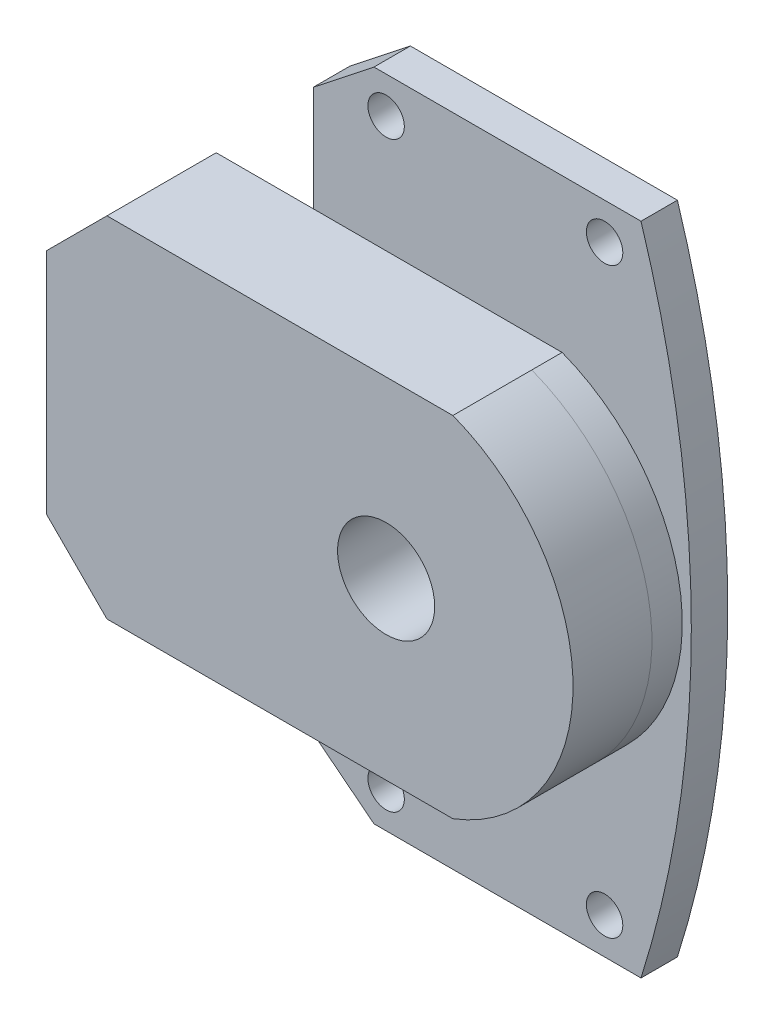
ISO-10303-21;
HEADER;
FILE_DESCRIPTION(('STEP AP214'),'2;1');
FILE_NAME('part.step','',(''),(''),'','','');
FILE_SCHEMA(('AUTOMOTIVE_DESIGN { 1 0 10303 214 1 1 1 1 }'));
ENDSEC;
DATA;
#1=APPLICATION_CONTEXT('core data for automotive mechanical design processes');
#2=APPLICATION_PROTOCOL_DEFINITION('international standard','automotive_design',2000,#1);
#3=PRODUCT_CONTEXT('',#1,'mechanical');
#4=PRODUCT('Part','Part','',(#3));
#5=PRODUCT_RELATED_PRODUCT_CATEGORY('part','',(#4));
#6=PRODUCT_DEFINITION_FORMATION('','',#4);
#7=PRODUCT_DEFINITION_CONTEXT('part definition',#1,'design');
#8=PRODUCT_DEFINITION('design','',#6,#7);
#9=PRODUCT_DEFINITION_SHAPE('','',#8);
#10=(LENGTH_UNIT() NAMED_UNIT(*) SI_UNIT(.MILLI.,.METRE.));
#11=(NAMED_UNIT(*) PLANE_ANGLE_UNIT() SI_UNIT($,.RADIAN.));
#12=(NAMED_UNIT(*) SI_UNIT($,.STERADIAN.) SOLID_ANGLE_UNIT());
#13=UNCERTAINTY_MEASURE_WITH_UNIT(LENGTH_MEASURE(1.E-05),#10,'distance_accuracy_value','');
#14=(GEOMETRIC_REPRESENTATION_CONTEXT(3) GLOBAL_UNCERTAINTY_ASSIGNED_CONTEXT((#13)) GLOBAL_UNIT_ASSIGNED_CONTEXT((#10,
#11,#12)) REPRESENTATION_CONTEXT('',''));
#15=CARTESIAN_POINT('',(0.,0.,0.));
#16=DIRECTION('',(0.,0.,1.));
#17=DIRECTION('',(1.,0.,0.));
#18=AXIS2_PLACEMENT_3D('',#15,#16,#17);
#19=CARTESIAN_POINT('',(-87.5169435511757,-10.5980462863294,-3.));
#20=DIRECTION('',(0.,0.,-1.));
#21=DIRECTION('',(-1.,0.,0.));
#22=AXIS2_PLACEMENT_3D('',#19,#20,#21);
#23=PLANE('',#22);
#24=CARTESIAN_POINT('',(-4.66241542365062,-34.5980462863294,-3.));
#25=DIRECTION('',(0.,0.,-1.));
#26=DIRECTION('',(1.,0.,0.));
#27=AXIS2_PLACEMENT_3D('',#24,#25,#26);
#28=CIRCLE('',#27,1.5);
#29=CARTESIAN_POINT('',(-3.16241542365062,-34.5980462863294,-3.));
#30=VERTEX_POINT('',#29);
#31=EDGE_CURVE('E207',#30,#30,#28,.T.);
#32=ORIENTED_EDGE('',*,*,#31,.F.);
#33=EDGE_LOOP('',(#32));
#34=FACE_BOUND('',#33,.T.);
#35=CARTESIAN_POINT('',(-4.66241542365062,13.4019537136706,-3.));
#36=DIRECTION('',(0.,0.,-1.));
#37=DIRECTION('',(-1.,0.,0.));
#38=AXIS2_PLACEMENT_3D('',#35,#36,#37);
#39=CIRCLE('',#38,1.5);
#40=CARTESIAN_POINT('',(-6.16241542365062,13.4019537136706,-3.));
#41=VERTEX_POINT('',#40);
#42=EDGE_CURVE('E219',#41,#41,#39,.T.);
#43=ORIENTED_EDGE('',*,*,#42,.F.);
#44=EDGE_LOOP('',(#43));
#45=FACE_BOUND('',#44,.T.);
#46=DIRECTION('',(-0.785278343538107,0.619142893983325,0.));
#47=VECTOR('',#46,1.);
#48=CARTESIAN_POINT('',(-28.6624154236506,-33.6558587863294,-3.));
#49=LINE('',#48,#47);
#50=CARTESIAN_POINT('',(-23.6624154236506,-37.5980462863294,-3.));
#51=VERTEX_POINT('',#50);
#52=CARTESIAN_POINT('',(-28.6624154236506,-33.6558587863294,-3.));
#53=VERTEX_POINT('',#52);
#54=EDGE_CURVE('E143',#51,#53,#49,.T.);
#55=ORIENTED_EDGE('',*,*,#54,.T.);
#56=DIRECTION('',(0.,1.,0.));
#57=VECTOR('',#56,1.);
#58=CARTESIAN_POINT('',(-28.6624154236506,12.4597662136706,-3.));
#59=LINE('',#58,#57);
#60=CARTESIAN_POINT('',(-28.6624154236506,12.4597662136706,-3.));
#61=VERTEX_POINT('',#60);
#62=EDGE_CURVE('E101',#53,#61,#59,.T.);
#63=ORIENTED_EDGE('',*,*,#62,.T.);
#64=DIRECTION('',(0.785278343538107,0.619142893983325,0.));
#65=VECTOR('',#64,1.);
#66=CARTESIAN_POINT('',(-23.6624154236506,16.4019537136706,-3.));
#67=LINE('',#66,#65);
#68=CARTESIAN_POINT('',(-23.6624154236506,16.4019537136706,-3.));
#69=VERTEX_POINT('',#68);
#70=EDGE_CURVE('E114',#61,#69,#67,.T.);
#71=ORIENTED_EDGE('',*,*,#70,.T.);
#72=DIRECTION('',(1.,0.,0.));
#73=VECTOR('',#72,1.);
#74=CARTESIAN_POINT('',(-23.6624154236506,16.4019537136706,-3.));
#75=LINE('',#74,#73);
#76=CARTESIAN_POINT('',(-1.66241542365062,16.4019537136706,-3.));
#77=VERTEX_POINT('',#76);
#78=EDGE_CURVE('E108',#69,#77,#75,.T.);
#79=ORIENTED_EDGE('',*,*,#78,.T.);
#80=CARTESIAN_POINT('',(-87.5169435511757,-10.5980462863294,-3.));
#81=DIRECTION('',(0.,0.,-1.));
#82=DIRECTION('',(-1.,0.,0.));
#83=AXIS2_PLACEMENT_3D('',#80,#81,#82);
#84=CIRCLE('',#83,90.);
#85=CARTESIAN_POINT('',(-1.66241542365062,-37.5980462863294,-3.));
#86=VERTEX_POINT('',#85);
#87=EDGE_CURVE('E112',#77,#86,#84,.T.);
#88=ORIENTED_EDGE('',*,*,#87,.T.);
#89=DIRECTION('',(-1.,0.,0.));
#90=VECTOR('',#89,1.);
#91=CARTESIAN_POINT('',(-23.6624154236506,-37.5980462863294,-3.));
#92=LINE('',#91,#90);
#93=EDGE_CURVE('E64',#86,#51,#92,.T.);
#94=ORIENTED_EDGE('',*,*,#93,.T.);
#95=EDGE_LOOP('',(#55,#63,#71,#79,#88,#94));
#96=FACE_BOUND('',#95,.T.);
#97=CARTESIAN_POINT('',(-13.6624154236506,-10.5980462863294,-3.));
#98=DIRECTION('',(0.,0.,-1.));
#99=DIRECTION('',(-1.,0.,0.));
#100=AXIS2_PLACEMENT_3D('',#97,#98,#99);
#101=CIRCLE('',#100,10.);
#102=CARTESIAN_POINT('',(-23.6624154236506,-10.5980462863294,-3.));
#103=VERTEX_POINT('',#102);
#104=EDGE_CURVE('E136',#103,#103,#101,.T.);
#105=ORIENTED_EDGE('',*,*,#104,.F.);
#106=EDGE_LOOP('',(#105));
#107=FACE_BOUND('',#106,.T.);
#108=CARTESIAN_POINT('',(-22.6624154236506,13.4019537136706,-3.));
#109=DIRECTION('',(0.,0.,-1.));
#110=DIRECTION('',(1.,0.,0.));
#111=AXIS2_PLACEMENT_3D('',#108,#109,#110);
#112=CIRCLE('',#111,1.5);
#113=CARTESIAN_POINT('',(-21.1624154236506,13.4019537136706,-3.));
#114=VERTEX_POINT('',#113);
#115=EDGE_CURVE('E213',#114,#114,#112,.T.);
#116=ORIENTED_EDGE('',*,*,#115,.F.);
#117=EDGE_LOOP('',(#116));
#118=FACE_BOUND('',#117,.T.);
#119=CARTESIAN_POINT('',(-22.6624154236506,-34.5980462863294,-3.));
#120=DIRECTION('',(0.,0.,-1.));
#121=DIRECTION('',(-1.,0.,0.));
#122=AXIS2_PLACEMENT_3D('',#119,#120,#121);
#123=CIRCLE('',#122,1.5);
#124=CARTESIAN_POINT('',(-24.1624154236506,-34.5980462863294,-3.));
#125=VERTEX_POINT('',#124);
#126=EDGE_CURVE('E198',#125,#125,#123,.T.);
#127=ORIENTED_EDGE('',*,*,#126,.F.);
#128=EDGE_LOOP('',(#127));
#129=FACE_BOUND('',#128,.T.);
#130=ADVANCED_FACE('F47',(#34,#45,#96,#107,#118,#129),#23,.T.);
#131=CARTESIAN_POINT('',(-87.5169435511757,-10.5980462863294,0.));
#132=DIRECTION('',(0.,0.,-1.));
#133=DIRECTION('',(-1.,0.,0.));
#134=AXIS2_PLACEMENT_3D('',#131,#132,#133);
#135=PLANE('',#134);
#136=DIRECTION('',(-0.785278343538107,0.619142893983325,0.));
#137=VECTOR('',#136,1.);
#138=CARTESIAN_POINT('',(-28.6624154236506,-33.6558587863294,0.));
#139=LINE('',#138,#137);
#140=CARTESIAN_POINT('',(-23.6624154236506,-37.5980462863294,0.));
#141=VERTEX_POINT('',#140);
#142=CARTESIAN_POINT('',(-28.6624154236506,-33.6558587863294,0.));
#143=VERTEX_POINT('',#142);
#144=EDGE_CURVE('E132',#141,#143,#139,.T.);
#145=ORIENTED_EDGE('',*,*,#144,.F.);
#146=DIRECTION('',(-1.,0.,0.));
#147=VECTOR('',#146,1.);
#148=CARTESIAN_POINT('',(-23.6624154236506,-37.5980462863294,0.));
#149=LINE('',#148,#147);
#150=CARTESIAN_POINT('',(-1.66241542365062,-37.5980462863294,0.));
#151=VERTEX_POINT('',#150);
#152=EDGE_CURVE('E93',#151,#141,#149,.T.);
#153=ORIENTED_EDGE('',*,*,#152,.F.);
#154=CARTESIAN_POINT('',(-87.5169435511757,-10.5980462863294,0.));
#155=DIRECTION('',(0.,0.,-1.));
#156=DIRECTION('',(-1.,0.,0.));
#157=AXIS2_PLACEMENT_3D('',#154,#155,#156);
#158=CIRCLE('',#157,90.);
#159=CARTESIAN_POINT('',(-1.66241542365062,16.4019537136706,0.));
#160=VERTEX_POINT('',#159);
#161=EDGE_CURVE('E87',#160,#151,#158,.T.);
#162=ORIENTED_EDGE('',*,*,#161,.F.);
#163=DIRECTION('',(1.,0.,0.));
#164=VECTOR('',#163,1.);
#165=CARTESIAN_POINT('',(-23.6624154236506,16.4019537136706,0.));
#166=LINE('',#165,#164);
#167=CARTESIAN_POINT('',(-23.6624154236506,16.4019537136706,0.));
#168=VERTEX_POINT('',#167);
#169=EDGE_CURVE('E122',#168,#160,#166,.T.);
#170=ORIENTED_EDGE('',*,*,#169,.F.);
#171=DIRECTION('',(0.785278343538107,0.619142893983325,0.));
#172=VECTOR('',#171,1.);
#173=CARTESIAN_POINT('',(-23.6624154236506,16.4019537136706,0.));
#174=LINE('',#173,#172);
#175=CARTESIAN_POINT('',(-28.6624154236506,12.4597662136706,0.));
#176=VERTEX_POINT('',#175);
#177=EDGE_CURVE('E138',#176,#168,#174,.T.);
#178=ORIENTED_EDGE('',*,*,#177,.F.);
#179=DIRECTION('',(0.,1.,0.));
#180=VECTOR('',#179,1.);
#181=CARTESIAN_POINT('',(-28.6624154236506,12.4597662136706,0.));
#182=LINE('',#181,#180);
#183=EDGE_CURVE('E135',#143,#176,#182,.T.);
#184=ORIENTED_EDGE('',*,*,#183,.F.);
#185=EDGE_LOOP('',(#145,#153,#162,#170,#178,#184));
#186=FACE_BOUND('',#185,.T.);
#187=CARTESIAN_POINT('',(-13.6624154236506,-10.5980462863294,0.));
#188=DIRECTION('',(0.,0.,-1.));
#189=DIRECTION('',(-1.,0.,0.));
#190=AXIS2_PLACEMENT_3D('',#187,#188,#189);
#191=CIRCLE('',#190,10.);
#192=CARTESIAN_POINT('',(-23.6624154236506,-10.5980462863294,0.));
#193=VERTEX_POINT('',#192);
#194=EDGE_CURVE('E222',#193,#193,#191,.T.);
#195=ORIENTED_EDGE('',*,*,#194,.T.);
#196=EDGE_LOOP('',(#195));
#197=FACE_BOUND('',#196,.T.);
#198=CARTESIAN_POINT('',(-4.66241542365062,13.4019537136706,0.));
#199=DIRECTION('',(0.,0.,-1.));
#200=DIRECTION('',(-1.,0.,0.));
#201=AXIS2_PLACEMENT_3D('',#198,#199,#200);
#202=CIRCLE('',#201,1.5);
#203=CARTESIAN_POINT('',(-6.16241542365062,13.4019537136706,0.));
#204=VERTEX_POINT('',#203);
#205=EDGE_CURVE('E216',#204,#204,#202,.T.);
#206=ORIENTED_EDGE('',*,*,#205,.T.);
#207=EDGE_LOOP('',(#206));
#208=FACE_BOUND('',#207,.T.);
#209=CARTESIAN_POINT('',(-22.6624154236506,13.4019537136706,0.));
#210=DIRECTION('',(0.,0.,-1.));
#211=DIRECTION('',(1.,0.,0.));
#212=AXIS2_PLACEMENT_3D('',#209,#210,#211);
#213=CIRCLE('',#212,1.5);
#214=CARTESIAN_POINT('',(-21.1624154236506,13.4019537136706,0.));
#215=VERTEX_POINT('',#214);
#216=EDGE_CURVE('E210',#215,#215,#213,.T.);
#217=ORIENTED_EDGE('',*,*,#216,.T.);
#218=EDGE_LOOP('',(#217));
#219=FACE_BOUND('',#218,.T.);
#220=CARTESIAN_POINT('',(-4.66241542365062,-34.5980462863294,0.));
#221=DIRECTION('',(0.,0.,-1.));
#222=DIRECTION('',(1.,0.,0.));
#223=AXIS2_PLACEMENT_3D('',#220,#221,#222);
#224=CIRCLE('',#223,1.5);
#225=CARTESIAN_POINT('',(-3.16241542365062,-34.5980462863294,0.));
#226=VERTEX_POINT('',#225);
#227=EDGE_CURVE('E204',#226,#226,#224,.T.);
#228=ORIENTED_EDGE('',*,*,#227,.T.);
#229=EDGE_LOOP('',(#228));
#230=FACE_BOUND('',#229,.T.);
#231=CARTESIAN_POINT('',(-22.6624154236506,-34.5980462863294,0.));
#232=DIRECTION('',(0.,0.,-1.));
#233=DIRECTION('',(-1.,0.,0.));
#234=AXIS2_PLACEMENT_3D('',#231,#232,#233);
#235=CIRCLE('',#234,1.5);
#236=CARTESIAN_POINT('',(-24.1624154236506,-34.5980462863294,0.));
#237=VERTEX_POINT('',#236);
#238=EDGE_CURVE('E201',#237,#237,#235,.T.);
#239=ORIENTED_EDGE('',*,*,#238,.T.);
#240=EDGE_LOOP('',(#239));
#241=FACE_BOUND('',#240,.T.);
#242=ADVANCED_FACE('F152',(#186,#197,#208,#219,#230,#241),#135,.F.);
#243=CARTESIAN_POINT('',(-28.6624154236506,-33.6558587863294,-3.));
#244=DIRECTION('',(0.619142893983325,0.785278343538107,0.));
#245=DIRECTION('',(-0.785278343538107,0.619142893983325,0.));
#246=AXIS2_PLACEMENT_3D('',#243,#244,#245);
#247=PLANE('',#246);
#248=ORIENTED_EDGE('',*,*,#144,.T.);
#249=DIRECTION('',(0.,0.,1.));
#250=VECTOR('',#249,1.);
#251=CARTESIAN_POINT('',(-28.6624154236506,-33.6558587863294,-3.));
#252=LINE('',#251,#250);
#253=EDGE_CURVE('E12',#53,#143,#252,.T.);
#254=ORIENTED_EDGE('',*,*,#253,.F.);
#255=ORIENTED_EDGE('',*,*,#54,.F.);
#256=DIRECTION('',(0.,0.,1.));
#257=VECTOR('',#256,1.);
#258=CARTESIAN_POINT('',(-23.6624154236506,-37.5980462863294,-3.));
#259=LINE('',#258,#257);
#260=EDGE_CURVE('E128',#51,#141,#259,.T.);
#261=ORIENTED_EDGE('',*,*,#260,.T.);
#262=EDGE_LOOP('',(#248,#254,#255,#261));
#263=FACE_BOUND('',#262,.T.);
#264=ADVANCED_FACE('F49',(#263),#247,.F.);
#265=CARTESIAN_POINT('',(-28.6624154236506,12.4597662136706,-3.));
#266=DIRECTION('',(1.,0.,0.));
#267=DIRECTION('',(0.,1.,0.));
#268=AXIS2_PLACEMENT_3D('',#265,#266,#267);
#269=PLANE('',#268);
#270=ORIENTED_EDGE('',*,*,#183,.T.);
#271=DIRECTION('',(0.,0.,1.));
#272=VECTOR('',#271,1.);
#273=CARTESIAN_POINT('',(-28.6624154236506,12.4597662136706,-3.));
#274=LINE('',#273,#272);
#275=EDGE_CURVE('E56',#61,#176,#274,.T.);
#276=ORIENTED_EDGE('',*,*,#275,.F.);
#277=ORIENTED_EDGE('',*,*,#62,.F.);
#278=ORIENTED_EDGE('',*,*,#253,.T.);
#279=EDGE_LOOP('',(#270,#276,#277,#278));
#280=FACE_BOUND('',#279,.T.);
#281=ADVANCED_FACE('F289',(#280),#269,.F.);
#282=CARTESIAN_POINT('',(-23.6624154236506,16.4019537136706,-3.));
#283=DIRECTION('',(0.619142893983325,-0.785278343538107,0.));
#284=DIRECTION('',(0.785278343538107,0.619142893983325,0.));
#285=AXIS2_PLACEMENT_3D('',#282,#283,#284);
#286=PLANE('',#285);
#287=ORIENTED_EDGE('',*,*,#177,.T.);
#288=DIRECTION('',(0.,0.,1.));
#289=VECTOR('',#288,1.);
#290=CARTESIAN_POINT('',(-23.6624154236506,16.4019537136706,-3.));
#291=LINE('',#290,#289);
#292=EDGE_CURVE('E123',#69,#168,#291,.T.);
#293=ORIENTED_EDGE('',*,*,#292,.F.);
#294=ORIENTED_EDGE('',*,*,#70,.F.);
#295=ORIENTED_EDGE('',*,*,#275,.T.);
#296=EDGE_LOOP('',(#287,#293,#294,#295));
#297=FACE_BOUND('',#296,.T.);
#298=ADVANCED_FACE('F149',(#297),#286,.F.);
#299=CARTESIAN_POINT('',(-23.6624154236506,16.4019537136706,-3.));
#300=DIRECTION('',(0.,-1.,0.));
#301=DIRECTION('',(1.,0.,0.));
#302=AXIS2_PLACEMENT_3D('',#299,#300,#301);
#303=PLANE('',#302);
#304=ORIENTED_EDGE('',*,*,#169,.T.);
#305=DIRECTION('',(0.,0.,1.));
#306=VECTOR('',#305,1.);
#307=CARTESIAN_POINT('',(-1.66241542365062,16.4019537136706,-3.));
#308=LINE('',#307,#306);
#309=EDGE_CURVE('E119',#77,#160,#308,.T.);
#310=ORIENTED_EDGE('',*,*,#309,.F.);
#311=ORIENTED_EDGE('',*,*,#78,.F.);
#312=ORIENTED_EDGE('',*,*,#292,.T.);
#313=EDGE_LOOP('',(#304,#310,#311,#312));
#314=FACE_BOUND('',#313,.T.);
#315=ADVANCED_FACE('F120',(#314),#303,.F.);
#316=CARTESIAN_POINT('',(-87.5169435511757,-10.5980462863294,-3.));
#317=DIRECTION('',(0.,0.,1.));
#318=DIRECTION('',(1.,0.,0.));
#319=AXIS2_PLACEMENT_3D('',#316,#317,#318);
#320=CYLINDRICAL_SURFACE('',#319,90.);
#321=ORIENTED_EDGE('',*,*,#161,.T.);
#322=DIRECTION('',(0.,0.,1.));
#323=VECTOR('',#322,1.);
#324=CARTESIAN_POINT('',(-1.66241542365062,-37.5980462863294,-3.));
#325=LINE('',#324,#323);
#326=EDGE_CURVE('E124',#86,#151,#325,.T.);
#327=ORIENTED_EDGE('',*,*,#326,.F.);
#328=ORIENTED_EDGE('',*,*,#87,.F.);
#329=ORIENTED_EDGE('',*,*,#309,.T.);
#330=EDGE_LOOP('',(#321,#327,#328,#329));
#331=FACE_BOUND('',#330,.T.);
#332=ADVANCED_FACE('F126',(#331),#320,.T.);
#333=CARTESIAN_POINT('',(-23.6624154236506,-37.5980462863294,-3.));
#334=DIRECTION('',(0.,1.,0.));
#335=DIRECTION('',(-1.,0.,0.));
#336=AXIS2_PLACEMENT_3D('',#333,#334,#335);
#337=PLANE('',#336);
#338=ORIENTED_EDGE('',*,*,#152,.T.);
#339=ORIENTED_EDGE('',*,*,#260,.F.);
#340=ORIENTED_EDGE('',*,*,#93,.F.);
#341=ORIENTED_EDGE('',*,*,#326,.T.);
#342=EDGE_LOOP('',(#338,#339,#340,#341));
#343=FACE_BOUND('',#342,.T.);
#344=ADVANCED_FACE('F157',(#343),#337,.F.);
#345=CARTESIAN_POINT('',(-13.6624154236506,-10.5980462863294,-3.));
#346=DIRECTION('',(0.,0.,1.));
#347=DIRECTION('',(1.,0.,0.));
#348=AXIS2_PLACEMENT_3D('',#345,#346,#347);
#349=CYLINDRICAL_SURFACE('',#348,10.);
#350=ORIENTED_EDGE('',*,*,#104,.T.);
#351=EDGE_LOOP('',(#350));
#352=FACE_BOUND('',#351,.T.);
#353=ORIENTED_EDGE('',*,*,#194,.F.);
#354=EDGE_LOOP('',(#353));
#355=FACE_BOUND('',#354,.T.);
#356=ADVANCED_FACE('F159',(#352,#355),#349,.F.);
#357=CARTESIAN_POINT('',(-4.66241542365062,13.4019537136706,-3.));
#358=DIRECTION('',(0.,0.,1.));
#359=DIRECTION('',(1.,0.,0.));
#360=AXIS2_PLACEMENT_3D('',#357,#358,#359);
#361=CYLINDRICAL_SURFACE('',#360,1.5);
#362=ORIENTED_EDGE('',*,*,#42,.T.);
#363=EDGE_LOOP('',(#362));
#364=FACE_BOUND('',#363,.T.);
#365=ORIENTED_EDGE('',*,*,#205,.F.);
#366=EDGE_LOOP('',(#365));
#367=FACE_BOUND('',#366,.T.);
#368=ADVANCED_FACE('F165',(#364,#367),#361,.F.);
#369=CARTESIAN_POINT('',(-22.6624154236506,13.4019537136706,-3.));
#370=DIRECTION('',(0.,0.,1.));
#371=DIRECTION('',(1.,0.,0.));
#372=AXIS2_PLACEMENT_3D('',#369,#370,#371);
#373=CYLINDRICAL_SURFACE('',#372,1.5);
#374=ORIENTED_EDGE('',*,*,#115,.T.);
#375=EDGE_LOOP('',(#374));
#376=FACE_BOUND('',#375,.T.);
#377=ORIENTED_EDGE('',*,*,#216,.F.);
#378=EDGE_LOOP('',(#377));
#379=FACE_BOUND('',#378,.T.);
#380=ADVANCED_FACE('F181',(#376,#379),#373,.F.);
#381=CARTESIAN_POINT('',(-4.66241542365062,-34.5980462863294,-3.));
#382=DIRECTION('',(0.,0.,1.));
#383=DIRECTION('',(1.,0.,0.));
#384=AXIS2_PLACEMENT_3D('',#381,#382,#383);
#385=CYLINDRICAL_SURFACE('',#384,1.5);
#386=ORIENTED_EDGE('',*,*,#31,.T.);
#387=EDGE_LOOP('',(#386));
#388=FACE_BOUND('',#387,.T.);
#389=ORIENTED_EDGE('',*,*,#227,.F.);
#390=EDGE_LOOP('',(#389));
#391=FACE_BOUND('',#390,.T.);
#392=ADVANCED_FACE('F185',(#388,#391),#385,.F.);
#393=CARTESIAN_POINT('',(-22.6624154236506,-34.5980462863294,-3.));
#394=DIRECTION('',(0.,0.,1.));
#395=DIRECTION('',(1.,0.,0.));
#396=AXIS2_PLACEMENT_3D('',#393,#394,#395);
#397=CYLINDRICAL_SURFACE('',#396,1.5);
#398=ORIENTED_EDGE('',*,*,#126,.T.);
#399=EDGE_LOOP('',(#398));
#400=FACE_BOUND('',#399,.T.);
#401=ORIENTED_EDGE('',*,*,#238,.F.);
#402=EDGE_LOOP('',(#401));
#403=FACE_BOUND('',#402,.T.);
#404=ADVANCED_FACE('F189',(#400,#403),#397,.F.);
#405=CLOSED_SHELL('',(#130,#242,#264,#281,#298,#315,#332,#344,#356,#368,#380,#392,#404));
#406=MANIFOLD_SOLID_BREP('B2',#405);
#407=CARTESIAN_POINT('',(-13.6624154236506,-10.5980462863294,1.74455679792347E-13));
#408=DIRECTION('',(0.,0.,1.));
#409=DIRECTION('',(1.,0.,0.));
#410=AXIS2_PLACEMENT_3D('',#407,#408,#409);
#411=PLANE('',#410);
#412=DIRECTION('',(-0.707106781186547,-0.707106781186548,0.));
#413=VECTOR('',#412,1.);
#414=CARTESIAN_POINT('',(-36.6624154236506,3.78695371367061,1.74455679792347E-13));
#415=LINE('',#414,#413);
#416=CARTESIAN_POINT('',(-36.6624154236506,3.78695371367061,1.74455679792347E-13));
#417=VERTEX_POINT('',#416);
#418=CARTESIAN_POINT('',(-41.6624154236506,-1.21304628632939,1.74455679792347E-13));
#419=VERTEX_POINT('',#418);
#420=EDGE_CURVE('E387',#417,#419,#415,.T.);
#421=ORIENTED_EDGE('',*,*,#420,.F.);
#422=DIRECTION('',(-1.,0.,0.));
#423=VECTOR('',#422,1.);
#424=CARTESIAN_POINT('',(-19.1624154236506,3.78695371367061,1.74455679792347E-13));
#425=LINE('',#424,#423);
#426=CARTESIAN_POINT('',(-8.16241542365062,3.78695371367061,1.74455679792347E-13));
#427=VERTEX_POINT('',#426);
#428=EDGE_CURVE('E371',#427,#417,#425,.T.);
#429=ORIENTED_EDGE('',*,*,#428,.F.);
#430=CARTESIAN_POINT('',(-13.6624154236506,-10.5980462863294,1.74455679792347E-13));
#431=DIRECTION('',(0.,0.,1.));
#432=DIRECTION('',(1.,0.,0.));
#433=AXIS2_PLACEMENT_3D('',#430,#431,#432);
#434=CIRCLE('',#433,15.4005917094117);
#435=CARTESIAN_POINT('',(-8.16241542365062,-24.9830462863294,1.74455679792347E-13));
#436=VERTEX_POINT('',#435);
#437=EDGE_CURVE('E381',#436,#427,#434,.T.);
#438=ORIENTED_EDGE('',*,*,#437,.F.);
#439=DIRECTION('',(1.,0.,0.));
#440=VECTOR('',#439,1.);
#441=CARTESIAN_POINT('',(-19.1624154236506,-24.9830462863294,1.74455679792347E-13));
#442=LINE('',#441,#440);
#443=CARTESIAN_POINT('',(-36.6624154236506,-24.9830462863294,1.74455679792347E-13));
#444=VERTEX_POINT('',#443);
#445=EDGE_CURVE('E405',#444,#436,#442,.T.);
#446=ORIENTED_EDGE('',*,*,#445,.F.);
#447=DIRECTION('',(0.707106781186548,-0.707106781186547,0.));
#448=VECTOR('',#447,1.);
#449=CARTESIAN_POINT('',(-41.6624154236506,-19.9830462863294,1.74455679792347E-13));
#450=LINE('',#449,#448);
#451=CARTESIAN_POINT('',(-41.6624154236506,-19.9830462863294,1.74455679792347E-13));
#452=VERTEX_POINT('',#451);
#453=EDGE_CURVE('E396',#452,#444,#450,.T.);
#454=ORIENTED_EDGE('',*,*,#453,.F.);
#455=DIRECTION('',(0.,-1.,0.));
#456=VECTOR('',#455,1.);
#457=CARTESIAN_POINT('',(-41.6624154236506,-1.21304628632939,1.74455679792347E-13));
#458=LINE('',#457,#456);
#459=EDGE_CURVE('E393',#419,#452,#458,.T.);
#460=ORIENTED_EDGE('',*,*,#459,.F.);
#461=EDGE_LOOP('',(#421,#429,#438,#446,#454,#460));
#462=FACE_BOUND('',#461,.T.);
#463=CARTESIAN_POINT('',(-29.4124154236506,-21.0780462863294,1.74455679792347E-13));
#464=DIRECTION('',(0.,0.,1.));
#465=DIRECTION('',(1.,0.,0.));
#466=AXIS2_PLACEMENT_3D('',#463,#464,#465);
#467=CIRCLE('',#466,1.98);
#468=CARTESIAN_POINT('',(-27.4324154236506,-21.0780462863294,1.74455679792347E-13));
#469=VERTEX_POINT('',#468);
#470=EDGE_CURVE('E394',#469,#469,#467,.T.);
#471=ORIENTED_EDGE('',*,*,#470,.T.);
#472=EDGE_LOOP('',(#471));
#473=FACE_BOUND('',#472,.T.);
#474=CARTESIAN_POINT('',(-29.4124154236506,-0.118046286329387,1.74455679792347E-13));
#475=DIRECTION('',(0.,0.,1.));
#476=DIRECTION('',(1.,0.,0.));
#477=AXIS2_PLACEMENT_3D('',#474,#475,#476);
#478=CIRCLE('',#477,1.98);
#479=CARTESIAN_POINT('',(-27.4324154236506,-0.118046286329387,1.74455679792347E-13));
#480=VERTEX_POINT('',#479);
#481=EDGE_CURVE('E399',#480,#480,#478,.T.);
#482=ORIENTED_EDGE('',*,*,#481,.T.);
#483=EDGE_LOOP('',(#482));
#484=FACE_BOUND('',#483,.T.);
#485=CARTESIAN_POINT('',(-13.6624154236506,-10.5980462863294,1.74455679792347E-13));
#486=DIRECTION('',(0.,0.,1.));
#487=DIRECTION('',(1.,0.,0.));
#488=AXIS2_PLACEMENT_3D('',#485,#486,#487);
#489=CIRCLE('',#488,6.3);
#490=CARTESIAN_POINT('',(-7.36241542365062,-10.5980462863294,1.74455679792347E-13));
#491=VERTEX_POINT('',#490);
#492=EDGE_CURVE('E580',#491,#491,#489,.T.);
#493=ORIENTED_EDGE('',*,*,#492,.T.);
#494=EDGE_LOOP('',(#493));
#495=FACE_BOUND('',#494,.T.);
#496=CARTESIAN_POINT('',(-13.6624154236506,-1.07304628632939,1.74455679792347E-13));
#497=DIRECTION('',(0.,0.,1.));
#498=DIRECTION('',(1.,0.,0.));
#499=AXIS2_PLACEMENT_3D('',#496,#497,#498);
#500=CIRCLE('',#499,1.475);
#501=CARTESIAN_POINT('',(-12.1874154236506,-1.07304628632939,1.74455679792347E-13));
#502=VERTEX_POINT('',#501);
#503=EDGE_CURVE('E577',#502,#502,#500,.T.);
#504=ORIENTED_EDGE('',*,*,#503,.T.);
#505=EDGE_LOOP('',(#504));
#506=FACE_BOUND('',#505,.T.);
#507=CARTESIAN_POINT('',(-13.6624154236506,-20.1230462863294,1.74455679792347E-13));
#508=DIRECTION('',(0.,0.,1.));
#509=DIRECTION('',(1.,0.,0.));
#510=AXIS2_PLACEMENT_3D('',#507,#508,#509);
#511=CIRCLE('',#510,1.475);
#512=CARTESIAN_POINT('',(-12.1874154236506,-20.1230462863294,1.74455679792347E-13));
#513=VERTEX_POINT('',#512);
#514=EDGE_CURVE('E574',#513,#513,#511,.T.);
#515=ORIENTED_EDGE('',*,*,#514,.T.);
#516=EDGE_LOOP('',(#515));
#517=FACE_BOUND('',#516,.T.);
#518=CARTESIAN_POINT('',(-4.6821593025815,-19.5783024073986,1.74455679792347E-13));
#519=DIRECTION('',(0.,0.,1.));
#520=DIRECTION('',(1.,0.,0.));
#521=AXIS2_PLACEMENT_3D('',#518,#519,#520);
#522=CIRCLE('',#521,1.05);
#523=CARTESIAN_POINT('',(-3.6321593025815,-19.5783024073986,1.74455679792347E-13));
#524=VERTEX_POINT('',#523);
#525=EDGE_CURVE('E571',#524,#524,#522,.T.);
#526=ORIENTED_EDGE('',*,*,#525,.T.);
#527=EDGE_LOOP('',(#526));
#528=FACE_BOUND('',#527,.T.);
#529=CARTESIAN_POINT('',(-4.6821593025815,-1.61779016526022,1.74455679792347E-13));
#530=DIRECTION('',(0.,0.,1.));
#531=DIRECTION('',(1.,0.,0.));
#532=AXIS2_PLACEMENT_3D('',#529,#530,#531);
#533=CIRCLE('',#532,1.05);
#534=CARTESIAN_POINT('',(-3.6321593025815,-1.61779016526022,1.74455679792347E-13));
#535=VERTEX_POINT('',#534);
#536=EDGE_CURVE('E568',#535,#535,#533,.T.);
#537=ORIENTED_EDGE('',*,*,#536,.T.);
#538=EDGE_LOOP('',(#537));
#539=FACE_BOUND('',#538,.T.);
#540=CARTESIAN_POINT('',(-22.6426715447198,-1.61779016526022,1.74455679792347E-13));
#541=DIRECTION('',(0.,0.,1.));
#542=DIRECTION('',(1.,0.,0.));
#543=AXIS2_PLACEMENT_3D('',#540,#541,#542);
#544=CIRCLE('',#543,1.05);
#545=CARTESIAN_POINT('',(-21.5926715447198,-1.61779016526022,1.74455679792347E-13));
#546=VERTEX_POINT('',#545);
#547=EDGE_CURVE('E565',#546,#546,#544,.T.);
#548=ORIENTED_EDGE('',*,*,#547,.T.);
#549=EDGE_LOOP('',(#548));
#550=FACE_BOUND('',#549,.T.);
#551=CARTESIAN_POINT('',(-22.6426715447198,-19.5783024073986,1.74455679792347E-13));
#552=DIRECTION('',(0.,0.,1.));
#553=DIRECTION('',(1.,0.,0.));
#554=AXIS2_PLACEMENT_3D('',#551,#552,#553);
#555=CIRCLE('',#554,1.05);
#556=CARTESIAN_POINT('',(-21.5926715447198,-19.5783024073986,1.74455679792347E-13));
#557=VERTEX_POINT('',#556);
#558=EDGE_CURVE('E562',#557,#557,#555,.T.);
#559=ORIENTED_EDGE('',*,*,#558,.T.);
#560=EDGE_LOOP('',(#559));
#561=FACE_BOUND('',#560,.T.);
#562=CARTESIAN_POINT('',(-17.6624154236506,-3.66984305605386,1.74455679792347E-13));
#563=DIRECTION('',(0.,0.,1.));
#564=DIRECTION('',(1.,0.,0.));
#565=AXIS2_PLACEMENT_3D('',#562,#563,#564);
#566=CIRCLE('',#565,0.85);
#567=CARTESIAN_POINT('',(-16.8124154236506,-3.66984305605386,1.74455679792347E-13));
#568=VERTEX_POINT('',#567);
#569=EDGE_CURVE('E559',#568,#568,#566,.T.);
#570=ORIENTED_EDGE('',*,*,#569,.T.);
#571=EDGE_LOOP('',(#570));
#572=FACE_BOUND('',#571,.T.);
#573=CARTESIAN_POINT('',(-9.66241542365067,-17.5262495166049,1.74455679792347E-13));
#574=DIRECTION('',(0.,0.,1.));
#575=DIRECTION('',(1.,0.,0.));
#576=AXIS2_PLACEMENT_3D('',#573,#574,#575);
#577=CIRCLE('',#576,0.85);
#578=CARTESIAN_POINT('',(-8.81241542365067,-17.5262495166049,1.74455679792347E-13));
#579=VERTEX_POINT('',#578);
#580=EDGE_CURVE('E556',#579,#579,#577,.T.);
#581=ORIENTED_EDGE('',*,*,#580,.T.);
#582=EDGE_LOOP('',(#581));
#583=FACE_BOUND('',#582,.T.);
#584=ADVANCED_FACE('F328',(#462,#473,#484,#495,#506,#517,#528,#539,#550,#561,#572,#583),#411,.F.);
#585=CARTESIAN_POINT('',(-36.6624154236506,3.78695371367061,2.50000000000017));
#586=DIRECTION('',(0.707106781186548,-0.707106781186547,0.));
#587=DIRECTION('',(0.707106781186547,0.707106781186548,0.));
#588=AXIS2_PLACEMENT_3D('',#585,#586,#587);
#589=PLANE('',#588);
#590=ORIENTED_EDGE('',*,*,#420,.T.);
#591=DIRECTION('',(0.,0.,-1.));
#592=VECTOR('',#591,1.);
#593=CARTESIAN_POINT('',(-41.6624154236506,-1.21304628632939,2.50000000000017));
#594=LINE('',#593,#592);
#595=CARTESIAN_POINT('',(-41.6624154236506,-1.21304628632939,9.00000000000017));
#596=VERTEX_POINT('',#595);
#597=EDGE_CURVE('E45',#596,#419,#594,.T.);
#598=ORIENTED_EDGE('',*,*,#597,.F.);
#599=DIRECTION('',(-0.707106781186547,-0.707106781186548,0.));
#600=VECTOR('',#599,1.);
#601=CARTESIAN_POINT('',(-36.6624154236506,3.78695371367061,9.00000000000017));
#602=LINE('',#601,#600);
#603=CARTESIAN_POINT('',(-36.6624154236506,3.78695371367061,9.00000000000017));
#604=VERTEX_POINT('',#603);
#605=EDGE_CURVE('E389',#604,#596,#602,.T.);
#606=ORIENTED_EDGE('',*,*,#605,.F.);
#607=DIRECTION('',(0.,0.,-1.));
#608=VECTOR('',#607,1.);
#609=CARTESIAN_POINT('',(-36.6624154236506,3.78695371367061,2.50000000000017));
#610=LINE('',#609,#608);
#611=EDGE_CURVE('E377',#604,#417,#610,.T.);
#612=ORIENTED_EDGE('',*,*,#611,.T.);
#613=EDGE_LOOP('',(#590,#598,#606,#612));
#614=FACE_BOUND('',#613,.T.);
#615=ADVANCED_FACE('F330',(#614),#589,.F.);
#616=CARTESIAN_POINT('',(-41.6624154236506,-1.21304628632939,2.50000000000017));
#617=DIRECTION('',(1.,0.,0.));
#618=DIRECTION('',(0.,1.,0.));
#619=AXIS2_PLACEMENT_3D('',#616,#617,#618);
#620=PLANE('',#619);
#621=ORIENTED_EDGE('',*,*,#459,.T.);
#622=DIRECTION('',(0.,0.,-1.));
#623=VECTOR('',#622,1.);
#624=CARTESIAN_POINT('',(-41.6624154236506,-19.9830462863294,2.50000000000017));
#625=LINE('',#624,#623);
#626=CARTESIAN_POINT('',(-41.6624154236506,-19.9830462863294,9.00000000000017));
#627=VERTEX_POINT('',#626);
#628=EDGE_CURVE('E338',#627,#452,#625,.T.);
#629=ORIENTED_EDGE('',*,*,#628,.F.);
#630=DIRECTION('',(0.,-1.,0.));
#631=VECTOR('',#630,1.);
#632=CARTESIAN_POINT('',(-41.6624154236506,-19.9830462863294,9.00000000000017));
#633=LINE('',#632,#631);
#634=EDGE_CURVE('E683',#596,#627,#633,.T.);
#635=ORIENTED_EDGE('',*,*,#634,.F.);
#636=ORIENTED_EDGE('',*,*,#597,.T.);
#637=EDGE_LOOP('',(#621,#629,#635,#636));
#638=FACE_BOUND('',#637,.T.);
#639=ADVANCED_FACE('F439',(#638),#620,.F.);
#640=CARTESIAN_POINT('',(-41.6624154236506,-19.9830462863294,2.50000000000017));
#641=DIRECTION('',(0.707106781186547,0.707106781186548,0.));
#642=DIRECTION('',(-0.707106781186548,0.707106781186547,0.));
#643=AXIS2_PLACEMENT_3D('',#640,#641,#642);
#644=PLANE('',#643);
#645=ORIENTED_EDGE('',*,*,#453,.T.);
#646=DIRECTION('',(0.,0.,-1.));
#647=VECTOR('',#646,1.);
#648=CARTESIAN_POINT('',(-36.6624154236506,-24.9830462863294,2.50000000000017));
#649=LINE('',#648,#647);
#650=CARTESIAN_POINT('',(-36.6624154236506,-24.9830462863294,9.00000000000017));
#651=VERTEX_POINT('',#650);
#652=EDGE_CURVE('E408',#651,#444,#649,.T.);
#653=ORIENTED_EDGE('',*,*,#652,.F.);
#654=DIRECTION('',(0.707106781186548,-0.707106781186547,0.));
#655=VECTOR('',#654,1.);
#656=CARTESIAN_POINT('',(-36.6624154236506,-24.9830462863294,9.00000000000017));
#657=LINE('',#656,#655);
#658=EDGE_CURVE('E690',#627,#651,#657,.T.);
#659=ORIENTED_EDGE('',*,*,#658,.F.);
#660=ORIENTED_EDGE('',*,*,#628,.T.);
#661=EDGE_LOOP('',(#645,#653,#659,#660));
#662=FACE_BOUND('',#661,.T.);
#663=ADVANCED_FACE('F436',(#662),#644,.F.);
#664=CARTESIAN_POINT('',(-19.1624154236506,-24.9830462863294,2.50000000000017));
#665=DIRECTION('',(0.,1.,0.));
#666=DIRECTION('',(0.,0.,1.));
#667=AXIS2_PLACEMENT_3D('',#664,#665,#666);
#668=PLANE('',#667);
#669=ORIENTED_EDGE('',*,*,#445,.T.);
#670=DIRECTION('',(0.,0.,-1.));
#671=VECTOR('',#670,1.);
#672=CARTESIAN_POINT('',(-8.16241542365062,-24.9830462863294,2.50000000000017));
#673=LINE('',#672,#671);
#674=CARTESIAN_POINT('',(-8.16241542365062,-24.9830462863294,2.50000000000017));
#675=VERTEX_POINT('',#674);
#676=EDGE_CURVE('E411',#675,#436,#673,.T.);
#677=ORIENTED_EDGE('',*,*,#676,.F.);
#678=DIRECTION('',(0.,0.,-1.));
#679=VECTOR('',#678,1.);
#680=CARTESIAN_POINT('',(-8.16241542365061,-24.9830462863294,9.00000000000017));
#681=LINE('',#680,#679);
#682=CARTESIAN_POINT('',(-8.16241542365061,-24.9830462863294,9.00000000000017));
#683=VERTEX_POINT('',#682);
#684=EDGE_CURVE('E509',#683,#675,#681,.T.);
#685=ORIENTED_EDGE('',*,*,#684,.F.);
#686=DIRECTION('',(1.,0.,0.));
#687=VECTOR('',#686,1.);
#688=CARTESIAN_POINT('',(-8.16241542365062,-24.9830462863294,9.00000000000017));
#689=LINE('',#688,#687);
#690=EDGE_CURVE('E693',#651,#683,#689,.T.);
#691=ORIENTED_EDGE('',*,*,#690,.F.);
#692=ORIENTED_EDGE('',*,*,#652,.T.);
#693=EDGE_LOOP('',(#669,#677,#685,#691,#692));
#694=FACE_BOUND('',#693,.T.);
#695=ADVANCED_FACE('F432',(#694),#668,.F.);
#696=CARTESIAN_POINT('',(-13.6624154236506,-10.5980462863294,2.50000000000017));
#697=DIRECTION('',(0.,0.,-1.));
#698=DIRECTION('',(-1.,0.,0.));
#699=AXIS2_PLACEMENT_3D('',#696,#697,#698);
#700=CYLINDRICAL_SURFACE('',#699,15.4005917094117);
#701=ORIENTED_EDGE('',*,*,#437,.T.);
#702=DIRECTION('',(0.,0.,-1.));
#703=VECTOR('',#702,1.);
#704=CARTESIAN_POINT('',(-8.16241542365062,3.78695371367061,2.50000000000017));
#705=LINE('',#704,#703);
#706=CARTESIAN_POINT('',(-8.16241542365062,3.78695371367061,2.50000000000017));
#707=VERTEX_POINT('',#706);
#708=EDGE_CURVE('E347',#707,#427,#705,.T.);
#709=ORIENTED_EDGE('',*,*,#708,.F.);
#710=CARTESIAN_POINT('',(-13.6625687683024,-10.5980462863294,2.50000000000018));
#711=DIRECTION('',(0.,0.,1.));
#712=DIRECTION('',(0.357137822361272,-0.934051698697159,0.));
#713=AXIS2_PLACEMENT_3D('',#710,#711,#712);
#714=CIRCLE('',#713,15.4006464739206);
#715=EDGE_CURVE('E380',#675,#707,#714,.T.);
#716=ORIENTED_EDGE('',*,*,#715,.F.);
#717=ORIENTED_EDGE('',*,*,#676,.T.);
#718=EDGE_LOOP('',(#701,#709,#716,#717));
#719=FACE_BOUND('',#718,.T.);
#720=ADVANCED_FACE('F422',(#719),#700,.T.);
#721=CARTESIAN_POINT('',(-19.1624154236506,3.78695371367061,2.50000000000017));
#722=DIRECTION('',(0.,-1.,0.));
#723=DIRECTION('',(0.,0.,-1.));
#724=AXIS2_PLACEMENT_3D('',#721,#722,#723);
#725=PLANE('',#724);
#726=ORIENTED_EDGE('',*,*,#428,.T.);
#727=ORIENTED_EDGE('',*,*,#611,.F.);
#728=DIRECTION('',(-1.,0.,0.));
#729=VECTOR('',#728,1.);
#730=CARTESIAN_POINT('',(-36.6624154236506,3.78695371367061,9.00000000000017));
#731=LINE('',#730,#729);
#732=CARTESIAN_POINT('',(-8.16241542365062,3.78695371367061,9.00000000000017));
#733=VERTEX_POINT('',#732);
#734=EDGE_CURVE('E521',#733,#604,#731,.T.);
#735=ORIENTED_EDGE('',*,*,#734,.F.);
#736=DIRECTION('',(0.,0.,-1.));
#737=VECTOR('',#736,1.);
#738=CARTESIAN_POINT('',(-8.16241542365062,3.78695371367061,9.00000000000017));
#739=LINE('',#738,#737);
#740=EDGE_CURVE('E517',#733,#707,#739,.T.);
#741=ORIENTED_EDGE('',*,*,#740,.T.);
#742=ORIENTED_EDGE('',*,*,#708,.T.);
#743=EDGE_LOOP('',(#726,#727,#735,#741,#742));
#744=FACE_BOUND('',#743,.T.);
#745=ADVANCED_FACE('F375',(#744),#725,.F.);
#746=CARTESIAN_POINT('',(-29.4124154236506,-21.0780462863294,2.50000000000017));
#747=DIRECTION('',(0.,0.,-1.));
#748=DIRECTION('',(-1.,0.,0.));
#749=AXIS2_PLACEMENT_3D('',#746,#747,#748);
#750=CYLINDRICAL_SURFACE('',#749,1.98);
#751=CARTESIAN_POINT('',(-29.4124154236506,-21.0780462863294,2.50000000000017));
#752=DIRECTION('',(0.,0.,-1.));
#753=DIRECTION('',(-1.,0.,0.));
#754=AXIS2_PLACEMENT_3D('',#751,#752,#753);
#755=CIRCLE('',#754,1.98);
#756=CARTESIAN_POINT('',(-31.3924154236506,-21.0780462863294,2.50000000000017));
#757=VERTEX_POINT('',#756);
#758=EDGE_CURVE('E553',#757,#757,#755,.T.);
#759=ORIENTED_EDGE('',*,*,#758,.F.);
#760=EDGE_LOOP('',(#759));
#761=FACE_BOUND('',#760,.T.);
#762=ORIENTED_EDGE('',*,*,#470,.F.);
#763=EDGE_LOOP('',(#762));
#764=FACE_BOUND('',#763,.T.);
#765=ADVANCED_FACE('F450',(#761,#764),#750,.F.);
#766=CARTESIAN_POINT('',(-29.4124154236506,-0.118046286329387,2.50000000000017));
#767=DIRECTION('',(0.,0.,-1.));
#768=DIRECTION('',(-1.,0.,0.));
#769=AXIS2_PLACEMENT_3D('',#766,#767,#768);
#770=CYLINDRICAL_SURFACE('',#769,1.98);
#771=CARTESIAN_POINT('',(-29.4124154236506,-0.118046286329387,2.50000000000017));
#772=DIRECTION('',(0.,0.,-1.));
#773=DIRECTION('',(-1.,0.,0.));
#774=AXIS2_PLACEMENT_3D('',#771,#772,#773);
#775=CIRCLE('',#774,1.98);
#776=CARTESIAN_POINT('',(-31.3924154236506,-0.118046286329387,2.50000000000017));
#777=VERTEX_POINT('',#776);
#778=EDGE_CURVE('E550',#777,#777,#775,.T.);
#779=ORIENTED_EDGE('',*,*,#778,.F.);
#780=EDGE_LOOP('',(#779));
#781=FACE_BOUND('',#780,.T.);
#782=ORIENTED_EDGE('',*,*,#481,.F.);
#783=EDGE_LOOP('',(#782));
#784=FACE_BOUND('',#783,.T.);
#785=ADVANCED_FACE('F453',(#781,#784),#770,.F.);
#786=CARTESIAN_POINT('',(-13.6624154236506,-10.5980462863294,2.50000000000017));
#787=DIRECTION('',(0.,0.,-1.));
#788=DIRECTION('',(-1.,0.,0.));
#789=AXIS2_PLACEMENT_3D('',#786,#787,#788);
#790=CYLINDRICAL_SURFACE('',#789,6.3);
#791=CARTESIAN_POINT('',(-13.6624154236506,-10.5980462863294,2.50000000000017));
#792=DIRECTION('',(0.,0.,-1.));
#793=DIRECTION('',(-1.,0.,0.));
#794=AXIS2_PLACEMENT_3D('',#791,#792,#793);
#795=CIRCLE('',#794,6.3);
#796=CARTESIAN_POINT('',(-19.9624154236506,-10.5980462863294,2.50000000000017));
#797=VERTEX_POINT('',#796);
#798=EDGE_CURVE('E547',#797,#797,#795,.T.);
#799=ORIENTED_EDGE('',*,*,#798,.F.);
#800=EDGE_LOOP('',(#799));
#801=FACE_BOUND('',#800,.T.);
#802=ORIENTED_EDGE('',*,*,#492,.F.);
#803=EDGE_LOOP('',(#802));
#804=FACE_BOUND('',#803,.T.);
#805=ADVANCED_FACE('F457',(#801,#804),#790,.F.);
#806=CARTESIAN_POINT('',(-13.6624154236506,-1.07304628632939,2.50000000000017));
#807=DIRECTION('',(0.,0.,-1.));
#808=DIRECTION('',(-1.,0.,0.));
#809=AXIS2_PLACEMENT_3D('',#806,#807,#808);
#810=CYLINDRICAL_SURFACE('',#809,1.475);
#811=CARTESIAN_POINT('',(-13.6624154236506,-1.07304628632939,2.50000000000017));
#812=DIRECTION('',(0.,0.,-1.));
#813=DIRECTION('',(-1.,0.,0.));
#814=AXIS2_PLACEMENT_3D('',#811,#812,#813);
#815=CIRCLE('',#814,1.475);
#816=CARTESIAN_POINT('',(-15.1374154236506,-1.07304628632939,2.50000000000017));
#817=VERTEX_POINT('',#816);
#818=EDGE_CURVE('E544',#817,#817,#815,.T.);
#819=ORIENTED_EDGE('',*,*,#818,.F.);
#820=EDGE_LOOP('',(#819));
#821=FACE_BOUND('',#820,.T.);
#822=ORIENTED_EDGE('',*,*,#503,.F.);
#823=EDGE_LOOP('',(#822));
#824=FACE_BOUND('',#823,.T.);
#825=ADVANCED_FACE('F461',(#821,#824),#810,.F.);
#826=CARTESIAN_POINT('',(-13.6624154236506,-20.1230462863294,2.50000000000017));
#827=DIRECTION('',(0.,0.,-1.));
#828=DIRECTION('',(-1.,0.,0.));
#829=AXIS2_PLACEMENT_3D('',#826,#827,#828);
#830=CYLINDRICAL_SURFACE('',#829,1.475);
#831=CARTESIAN_POINT('',(-13.6624154236506,-20.1230462863294,2.50000000000017));
#832=DIRECTION('',(0.,0.,-1.));
#833=DIRECTION('',(-1.,0.,0.));
#834=AXIS2_PLACEMENT_3D('',#831,#832,#833);
#835=CIRCLE('',#834,1.475);
#836=CARTESIAN_POINT('',(-15.1374154236506,-20.1230462863294,2.50000000000017));
#837=VERTEX_POINT('',#836);
#838=EDGE_CURVE('E541',#837,#837,#835,.T.);
#839=ORIENTED_EDGE('',*,*,#838,.F.);
#840=EDGE_LOOP('',(#839));
#841=FACE_BOUND('',#840,.T.);
#842=ORIENTED_EDGE('',*,*,#514,.F.);
#843=EDGE_LOOP('',(#842));
#844=FACE_BOUND('',#843,.T.);
#845=ADVANCED_FACE('F465',(#841,#844),#830,.F.);
#846=CARTESIAN_POINT('',(-4.6821593025815,-19.5783024073986,2.50000000000017));
#847=DIRECTION('',(0.,0.,-1.));
#848=DIRECTION('',(-1.,0.,0.));
#849=AXIS2_PLACEMENT_3D('',#846,#847,#848);
#850=CYLINDRICAL_SURFACE('',#849,1.05);
#851=CARTESIAN_POINT('',(-4.6821593025815,-19.5783024073986,2.50000000000017));
#852=DIRECTION('',(0.,0.,-1.));
#853=DIRECTION('',(-1.,0.,0.));
#854=AXIS2_PLACEMENT_3D('',#851,#852,#853);
#855=CIRCLE('',#854,1.05);
#856=CARTESIAN_POINT('',(-5.7321593025815,-19.5783024073986,2.50000000000017));
#857=VERTEX_POINT('',#856);
#858=EDGE_CURVE('E538',#857,#857,#855,.T.);
#859=ORIENTED_EDGE('',*,*,#858,.F.);
#860=EDGE_LOOP('',(#859));
#861=FACE_BOUND('',#860,.T.);
#862=ORIENTED_EDGE('',*,*,#525,.F.);
#863=EDGE_LOOP('',(#862));
#864=FACE_BOUND('',#863,.T.);
#865=ADVANCED_FACE('F469',(#861,#864),#850,.F.);
#866=CARTESIAN_POINT('',(-4.6821593025815,-1.61779016526022,2.50000000000017));
#867=DIRECTION('',(0.,0.,-1.));
#868=DIRECTION('',(-1.,0.,0.));
#869=AXIS2_PLACEMENT_3D('',#866,#867,#868);
#870=CYLINDRICAL_SURFACE('',#869,1.05);
#871=CARTESIAN_POINT('',(-4.6821593025815,-1.61779016526022,2.50000000000017));
#872=DIRECTION('',(0.,0.,-1.));
#873=DIRECTION('',(-1.,0.,0.));
#874=AXIS2_PLACEMENT_3D('',#871,#872,#873);
#875=CIRCLE('',#874,1.05);
#876=CARTESIAN_POINT('',(-5.7321593025815,-1.61779016526022,2.50000000000017));
#877=VERTEX_POINT('',#876);
#878=EDGE_CURVE('E535',#877,#877,#875,.T.);
#879=ORIENTED_EDGE('',*,*,#878,.F.);
#880=EDGE_LOOP('',(#879));
#881=FACE_BOUND('',#880,.T.);
#882=ORIENTED_EDGE('',*,*,#536,.F.);
#883=EDGE_LOOP('',(#882));
#884=FACE_BOUND('',#883,.T.);
#885=ADVANCED_FACE('F473',(#881,#884),#870,.F.);
#886=CARTESIAN_POINT('',(-22.6426715447198,-1.61779016526022,2.50000000000017));
#887=DIRECTION('',(0.,0.,-1.));
#888=DIRECTION('',(-1.,0.,0.));
#889=AXIS2_PLACEMENT_3D('',#886,#887,#888);
#890=CYLINDRICAL_SURFACE('',#889,1.05);
#891=CARTESIAN_POINT('',(-22.6426715447198,-1.61779016526022,2.50000000000017));
#892=DIRECTION('',(0.,0.,-1.));
#893=DIRECTION('',(-1.,0.,0.));
#894=AXIS2_PLACEMENT_3D('',#891,#892,#893);
#895=CIRCLE('',#894,1.05);
#896=CARTESIAN_POINT('',(-23.6926715447198,-1.61779016526022,2.50000000000017));
#897=VERTEX_POINT('',#896);
#898=EDGE_CURVE('E532',#897,#897,#895,.T.);
#899=ORIENTED_EDGE('',*,*,#898,.F.);
#900=EDGE_LOOP('',(#899));
#901=FACE_BOUND('',#900,.T.);
#902=ORIENTED_EDGE('',*,*,#547,.F.);
#903=EDGE_LOOP('',(#902));
#904=FACE_BOUND('',#903,.T.);
#905=ADVANCED_FACE('F477',(#901,#904),#890,.F.);
#906=CARTESIAN_POINT('',(-22.6426715447198,-19.5783024073986,2.50000000000017));
#907=DIRECTION('',(0.,0.,-1.));
#908=DIRECTION('',(-1.,0.,0.));
#909=AXIS2_PLACEMENT_3D('',#906,#907,#908);
#910=CYLINDRICAL_SURFACE('',#909,1.05);
#911=CARTESIAN_POINT('',(-22.6426715447198,-19.5783024073986,2.50000000000017));
#912=DIRECTION('',(0.,0.,-1.));
#913=DIRECTION('',(-1.,0.,0.));
#914=AXIS2_PLACEMENT_3D('',#911,#912,#913);
#915=CIRCLE('',#914,1.05);
#916=CARTESIAN_POINT('',(-23.6926715447198,-19.5783024073986,2.50000000000017));
#917=VERTEX_POINT('',#916);
#918=EDGE_CURVE('E529',#917,#917,#915,.T.);
#919=ORIENTED_EDGE('',*,*,#918,.F.);
#920=EDGE_LOOP('',(#919));
#921=FACE_BOUND('',#920,.T.);
#922=ORIENTED_EDGE('',*,*,#558,.F.);
#923=EDGE_LOOP('',(#922));
#924=FACE_BOUND('',#923,.T.);
#925=ADVANCED_FACE('F481',(#921,#924),#910,.F.);
#926=CARTESIAN_POINT('',(-17.6624154236506,-3.66984305605386,2.50000000000017));
#927=DIRECTION('',(0.,0.,-1.));
#928=DIRECTION('',(-1.,0.,0.));
#929=AXIS2_PLACEMENT_3D('',#926,#927,#928);
#930=CYLINDRICAL_SURFACE('',#929,0.85);
#931=CARTESIAN_POINT('',(-17.6624154236506,-3.66984305605386,2.50000000000017));
#932=DIRECTION('',(0.,0.,-1.));
#933=DIRECTION('',(-1.,0.,0.));
#934=AXIS2_PLACEMENT_3D('',#931,#932,#933);
#935=CIRCLE('',#934,0.85);
#936=CARTESIAN_POINT('',(-18.5124154236506,-3.66984305605386,2.50000000000017));
#937=VERTEX_POINT('',#936);
#938=EDGE_CURVE('E526',#937,#937,#935,.T.);
#939=ORIENTED_EDGE('',*,*,#938,.F.);
#940=EDGE_LOOP('',(#939));
#941=FACE_BOUND('',#940,.T.);
#942=ORIENTED_EDGE('',*,*,#569,.F.);
#943=EDGE_LOOP('',(#942));
#944=FACE_BOUND('',#943,.T.);
#945=ADVANCED_FACE('F485',(#941,#944),#930,.F.);
#946=CARTESIAN_POINT('',(-9.66241542365067,-17.5262495166049,2.50000000000017));
#947=DIRECTION('',(0.,0.,-1.));
#948=DIRECTION('',(-1.,0.,0.));
#949=AXIS2_PLACEMENT_3D('',#946,#947,#948);
#950=CYLINDRICAL_SURFACE('',#949,0.85);
#951=CARTESIAN_POINT('',(-9.66241542365067,-17.5262495166049,2.50000000000017));
#952=DIRECTION('',(0.,0.,-1.));
#953=DIRECTION('',(-1.,0.,0.));
#954=AXIS2_PLACEMENT_3D('',#951,#952,#953);
#955=CIRCLE('',#954,0.85);
#956=CARTESIAN_POINT('',(-10.5124154236507,-17.5262495166049,2.50000000000017));
#957=VERTEX_POINT('',#956);
#958=EDGE_CURVE('E516',#957,#957,#955,.T.);
#959=ORIENTED_EDGE('',*,*,#958,.F.);
#960=EDGE_LOOP('',(#959));
#961=FACE_BOUND('',#960,.T.);
#962=ORIENTED_EDGE('',*,*,#580,.F.);
#963=EDGE_LOOP('',(#962));
#964=FACE_BOUND('',#963,.T.);
#965=ADVANCED_FACE('F489',(#961,#964),#950,.F.);
#966=CARTESIAN_POINT('',(-13.6625687683024,-10.5980462863294,2.50000000000017));
#967=DIRECTION('',(0.,0.,-1.));
#968=DIRECTION('',(-1.,0.,0.));
#969=AXIS2_PLACEMENT_3D('',#966,#967,#968);
#970=PLANE('',#969);
#971=ORIENTED_EDGE('',*,*,#958,.T.);
#972=EDGE_LOOP('',(#971));
#973=FACE_BOUND('',#972,.T.);
#974=ADVANCED_FACE('F493',(#973),#970,.T.);
#975=ORIENTED_EDGE('',*,*,#938,.T.);
#976=EDGE_LOOP('',(#975));
#977=FACE_BOUND('',#976,.T.);
#978=ADVANCED_FACE('F625',(#977),#970,.T.);
#979=ORIENTED_EDGE('',*,*,#918,.T.);
#980=EDGE_LOOP('',(#979));
#981=FACE_BOUND('',#980,.T.);
#982=ADVANCED_FACE('F630',(#981),#970,.T.);
#983=ORIENTED_EDGE('',*,*,#898,.T.);
#984=EDGE_LOOP('',(#983));
#985=FACE_BOUND('',#984,.T.);
#986=ADVANCED_FACE('F636',(#985),#970,.T.);
#987=ORIENTED_EDGE('',*,*,#878,.T.);
#988=EDGE_LOOP('',(#987));
#989=FACE_BOUND('',#988,.T.);
#990=ADVANCED_FACE('F642',(#989),#970,.T.);
#991=ORIENTED_EDGE('',*,*,#858,.T.);
#992=EDGE_LOOP('',(#991));
#993=FACE_BOUND('',#992,.T.);
#994=ADVANCED_FACE('F648',(#993),#970,.T.);
#995=ORIENTED_EDGE('',*,*,#838,.T.);
#996=EDGE_LOOP('',(#995));
#997=FACE_BOUND('',#996,.T.);
#998=ADVANCED_FACE('F654',(#997),#970,.T.);
#999=ORIENTED_EDGE('',*,*,#818,.T.);
#1000=EDGE_LOOP('',(#999));
#1001=FACE_BOUND('',#1000,.T.);
#1002=ADVANCED_FACE('F660',(#1001),#970,.T.);
#1003=CARTESIAN_POINT('',(-13.6625687683024,-10.5980462863294,2.50000000000017));
#1004=DIRECTION('',(0.,0.,-1.));
#1005=DIRECTION('',(-1.,0.,0.));
#1006=AXIS2_PLACEMENT_3D('',#1003,#1004,#1005);
#1007=CIRCLE('',#1006,4.);
#1008=CARTESIAN_POINT('',(-17.6625687683024,-10.5980462863294,2.50000000000017));
#1009=VERTEX_POINT('',#1008);
#1010=EDGE_CURVE('E678',#1009,#1009,#1007,.T.);
#1011=ORIENTED_EDGE('',*,*,#1010,.F.);
#1012=EDGE_LOOP('',(#1011));
#1013=FACE_BOUND('',#1012,.T.);
#1014=ORIENTED_EDGE('',*,*,#798,.T.);
#1015=EDGE_LOOP('',(#1014));
#1016=FACE_BOUND('',#1015,.T.);
#1017=ADVANCED_FACE('F622',(#1013,#1016),#970,.T.);
#1018=ORIENTED_EDGE('',*,*,#778,.T.);
#1019=EDGE_LOOP('',(#1018));
#1020=FACE_BOUND('',#1019,.T.);
#1021=ADVANCED_FACE('F618',(#1020),#970,.T.);
#1022=ORIENTED_EDGE('',*,*,#758,.T.);
#1023=EDGE_LOOP('',(#1022));
#1024=FACE_BOUND('',#1023,.T.);
#1025=ADVANCED_FACE('F500',(#1024),#970,.T.);
#1026=CARTESIAN_POINT('',(-13.6625687683024,-10.5980462863294,9.00000000000017));
#1027=DIRECTION('',(0.,0.,-1.));
#1028=DIRECTION('',(-1.,0.,0.));
#1029=AXIS2_PLACEMENT_3D('',#1026,#1027,#1028);
#1030=CYLINDRICAL_SURFACE('',#1029,15.4006464739207);
#1031=ORIENTED_EDGE('',*,*,#715,.T.);
#1032=ORIENTED_EDGE('',*,*,#740,.F.);
#1033=CARTESIAN_POINT('',(-13.6625687683024,-10.5980462863294,9.00000000000017));
#1034=DIRECTION('',(0.,0.,1.));
#1035=DIRECTION('',(-1.,0.,0.));
#1036=AXIS2_PLACEMENT_3D('',#1033,#1034,#1035);
#1037=CIRCLE('',#1036,15.4006464739207);
#1038=EDGE_CURVE('E696',#683,#733,#1037,.T.);
#1039=ORIENTED_EDGE('',*,*,#1038,.F.);
#1040=ORIENTED_EDGE('',*,*,#684,.T.);
#1041=EDGE_LOOP('',(#1031,#1032,#1039,#1040));
#1042=FACE_BOUND('',#1041,.T.);
#1043=ADVANCED_FACE('F495',(#1042),#1030,.T.);
#1044=CARTESIAN_POINT('',(-13.6625687683024,-10.5980462863294,9.00000000000017));
#1045=DIRECTION('',(0.,0.,-1.));
#1046=DIRECTION('',(-1.,0.,0.));
#1047=AXIS2_PLACEMENT_3D('',#1044,#1045,#1046);
#1048=PLANE('',#1047);
#1049=CARTESIAN_POINT('',(-13.6625687683024,-10.5980462863294,9.00000000000017));
#1050=DIRECTION('',(0.,0.,1.));
#1051=DIRECTION('',(1.,0.,0.));
#1052=AXIS2_PLACEMENT_3D('',#1049,#1050,#1051);
#1053=CIRCLE('',#1052,4.);
#1054=CARTESIAN_POINT('',(-9.66256876830243,-10.5980462863294,9.00000000000017));
#1055=VERTEX_POINT('',#1054);
#1056=EDGE_CURVE('E681',#1055,#1055,#1053,.T.);
#1057=ORIENTED_EDGE('',*,*,#1056,.F.);
#1058=EDGE_LOOP('',(#1057));
#1059=FACE_BOUND('',#1058,.T.);
#1060=ORIENTED_EDGE('',*,*,#605,.T.);
#1061=ORIENTED_EDGE('',*,*,#634,.T.);
#1062=ORIENTED_EDGE('',*,*,#658,.T.);
#1063=ORIENTED_EDGE('',*,*,#690,.T.);
#1064=ORIENTED_EDGE('',*,*,#1038,.T.);
#1065=ORIENTED_EDGE('',*,*,#734,.T.);
#1066=EDGE_LOOP('',(#1060,#1061,#1062,#1063,#1064,#1065));
#1067=FACE_BOUND('',#1066,.T.);
#1068=ADVANCED_FACE('F499',(#1059,#1067),#1048,.F.);
#1069=CARTESIAN_POINT('',(-13.6625687683024,-10.5980462863294,-0.999999999999826));
#1070=DIRECTION('',(0.,0.,1.));
#1071=DIRECTION('',(1.,0.,0.));
#1072=AXIS2_PLACEMENT_3D('',#1069,#1070,#1071);
#1073=CYLINDRICAL_SURFACE('',#1072,4.);
#1074=ORIENTED_EDGE('',*,*,#1010,.T.);
#1075=EDGE_LOOP('',(#1074));
#1076=FACE_BOUND('',#1075,.T.);
#1077=ORIENTED_EDGE('',*,*,#1056,.T.);
#1078=EDGE_LOOP('',(#1077));
#1079=FACE_BOUND('',#1078,.T.);
#1080=ADVANCED_FACE('F719',(#1076,#1079),#1073,.F.);
#1081=CLOSED_SHELL('',(#584,#615,#639,#663,#695,#720,#745,#765,#785,#805,#825,#845,#865,#885,
#905,#925,#945,#965,#974,#978,#982,#986,#990,#994,#998,#1002,#1017,#1021,#1025,#1043,#1068,#1080));
#1082=MANIFOLD_SOLID_BREP('B6_NOT_SHOWN',#1081);
#1083=ADVANCED_BREP_SHAPE_REPRESENTATION('',(#18,#406,#1082),#14);
#1084=SHAPE_DEFINITION_REPRESENTATION(#9,#1083);
ENDSEC;
END-ISO-10303-21;
